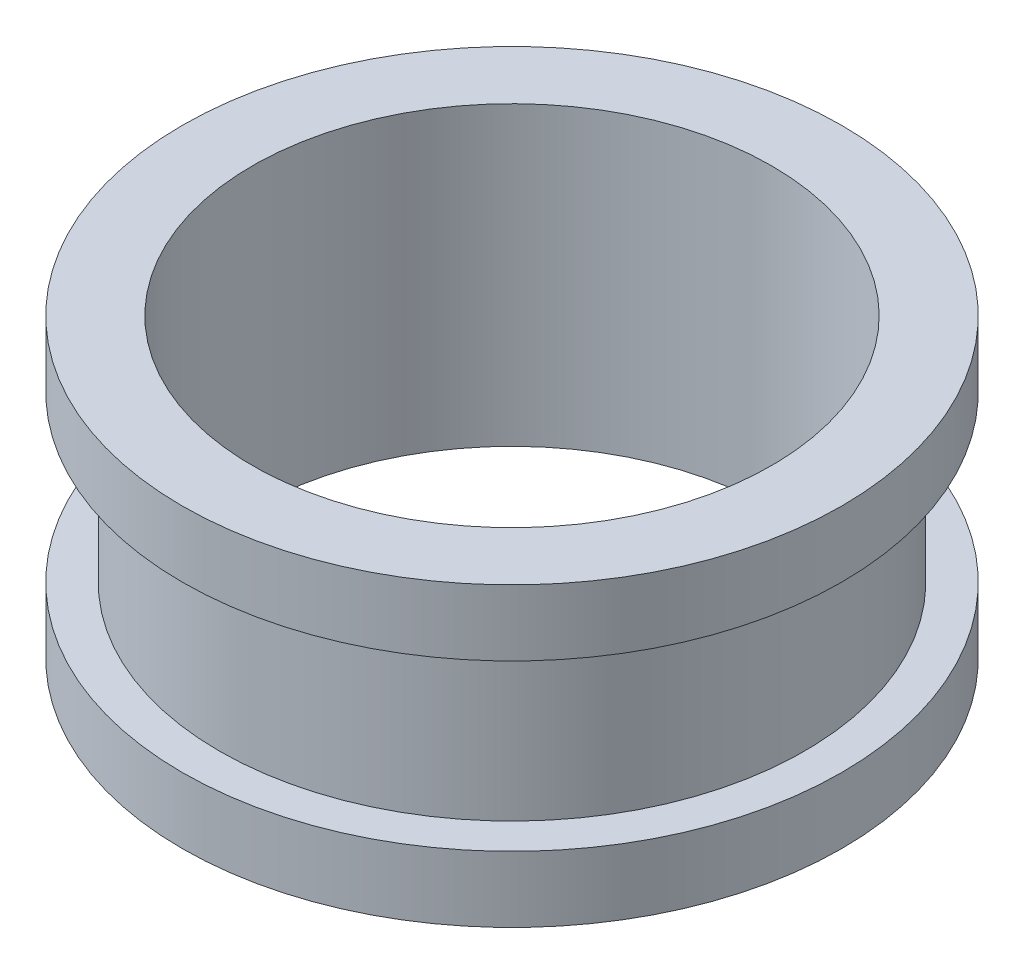
ISO-10303-21;
HEADER;
FILE_DESCRIPTION(('STEP AP214'),'2;1');
FILE_NAME('part.step','',(''),(''),'','','');
FILE_SCHEMA(('AUTOMOTIVE_DESIGN { 1 0 10303 214 1 1 1 1 }'));
ENDSEC;
DATA;
#1=APPLICATION_CONTEXT('core data for automotive mechanical design processes');
#2=APPLICATION_PROTOCOL_DEFINITION('international standard','automotive_design',2000,#1);
#3=PRODUCT_CONTEXT('',#1,'mechanical');
#4=PRODUCT('Part','Part','',(#3));
#5=PRODUCT_RELATED_PRODUCT_CATEGORY('part','',(#4));
#6=PRODUCT_DEFINITION_FORMATION('','',#4);
#7=PRODUCT_DEFINITION_CONTEXT('part definition',#1,'design');
#8=PRODUCT_DEFINITION('design','',#6,#7);
#9=PRODUCT_DEFINITION_SHAPE('','',#8);
#10=(LENGTH_UNIT() NAMED_UNIT(*) SI_UNIT(.MILLI.,.METRE.));
#11=(NAMED_UNIT(*) PLANE_ANGLE_UNIT() SI_UNIT($,.RADIAN.));
#12=(NAMED_UNIT(*) SI_UNIT($,.STERADIAN.) SOLID_ANGLE_UNIT());
#13=UNCERTAINTY_MEASURE_WITH_UNIT(LENGTH_MEASURE(1.E-05),#10,'distance_accuracy_value','');
#14=(GEOMETRIC_REPRESENTATION_CONTEXT(3) GLOBAL_UNCERTAINTY_ASSIGNED_CONTEXT((#13)) GLOBAL_UNIT_ASSIGNED_CONTEXT((#10,
#11,#12)) REPRESENTATION_CONTEXT('',''));
#15=CARTESIAN_POINT('',(0.,0.,0.));
#16=DIRECTION('',(0.,0.,1.));
#17=DIRECTION('',(1.,0.,0.));
#18=AXIS2_PLACEMENT_3D('',#15,#16,#17);
#19=CARTESIAN_POINT('',(4.,-0.8,0.));
#20=DIRECTION('',(0.,-1.,0.));
#21=DIRECTION('',(0.,0.,-1.));
#22=AXIS2_PLACEMENT_3D('',#19,#20,#21);
#23=PLANE('',#22);
#24=CARTESIAN_POINT('',(0.,-0.799999999999995,0.));
#25=DIRECTION('',(0.,-1.,0.));
#26=DIRECTION('',(0.,0.,-1.));
#27=AXIS2_PLACEMENT_3D('',#24,#25,#26);
#28=CIRCLE('',#27,4.);
#29=CARTESIAN_POINT('',(0.,-0.799999999999995,-4.));
#30=VERTEX_POINT('',#29);
#31=EDGE_CURVE('E63',#30,#30,#28,.T.);
#32=ORIENTED_EDGE('',*,*,#31,.T.);
#33=EDGE_LOOP('',(#32));
#34=FACE_BOUND('',#33,.T.);
#35=CARTESIAN_POINT('',(0.,-0.799999999999995,0.));
#36=DIRECTION('',(0.,-1.,0.));
#37=DIRECTION('',(0.,0.,-1.));
#38=AXIS2_PLACEMENT_3D('',#35,#36,#37);
#39=CIRCLE('',#38,3.15);
#40=CARTESIAN_POINT('',(0.,-0.799999999999995,-3.15));
#41=VERTEX_POINT('',#40);
#42=EDGE_CURVE('E10',#41,#41,#39,.T.);
#43=ORIENTED_EDGE('',*,*,#42,.F.);
#44=EDGE_LOOP('',(#43));
#45=FACE_BOUND('',#44,.T.);
#46=ADVANCED_FACE('F35',(#34,#45),#23,.T.);
#47=CARTESIAN_POINT('',(0.,-200.,0.));
#48=DIRECTION('',(0.,-1.,0.));
#49=DIRECTION('',(0.,0.,-1.));
#50=AXIS2_PLACEMENT_3D('',#47,#48,#49);
#51=CYLINDRICAL_SURFACE('',#50,3.15);
#52=ORIENTED_EDGE('',*,*,#42,.T.);
#53=EDGE_LOOP('',(#52));
#54=FACE_BOUND('',#53,.T.);
#55=CARTESIAN_POINT('',(0.,2.8,0.));
#56=DIRECTION('',(0.,-1.,0.));
#57=DIRECTION('',(0.,0.,-1.));
#58=AXIS2_PLACEMENT_3D('',#55,#56,#57);
#59=CIRCLE('',#58,3.15);
#60=CARTESIAN_POINT('',(0.,2.8,-3.15));
#61=VERTEX_POINT('',#60);
#62=EDGE_CURVE('E41',#61,#61,#59,.T.);
#63=ORIENTED_EDGE('',*,*,#62,.F.);
#64=EDGE_LOOP('',(#63));
#65=FACE_BOUND('',#64,.T.);
#66=ADVANCED_FACE('F81',(#54,#65),#51,.F.);
#67=CARTESIAN_POINT('',(3.15,2.8,0.));
#68=DIRECTION('',(0.,1.,0.));
#69=DIRECTION('',(0.,0.,1.));
#70=AXIS2_PLACEMENT_3D('',#67,#68,#69);
#71=PLANE('',#70);
#72=ORIENTED_EDGE('',*,*,#62,.T.);
#73=EDGE_LOOP('',(#72));
#74=FACE_BOUND('',#73,.T.);
#75=CARTESIAN_POINT('',(0.,2.8,0.));
#76=DIRECTION('',(0.,-1.,0.));
#77=DIRECTION('',(0.,0.,-1.));
#78=AXIS2_PLACEMENT_3D('',#75,#76,#77);
#79=CIRCLE('',#78,4.);
#80=CARTESIAN_POINT('',(0.,2.8,-4.));
#81=VERTEX_POINT('',#80);
#82=EDGE_CURVE('E45',#81,#81,#79,.T.);
#83=ORIENTED_EDGE('',*,*,#82,.F.);
#84=EDGE_LOOP('',(#83));
#85=FACE_BOUND('',#84,.T.);
#86=ADVANCED_FACE('F85',(#74,#85),#71,.T.);
#87=CARTESIAN_POINT('',(0.,-200.,0.));
#88=DIRECTION('',(0.,-1.,0.));
#89=DIRECTION('',(0.,0.,-1.));
#90=AXIS2_PLACEMENT_3D('',#87,#88,#89);
#91=CYLINDRICAL_SURFACE('',#90,4.);
#92=ORIENTED_EDGE('',*,*,#82,.T.);
#93=EDGE_LOOP('',(#92));
#94=FACE_BOUND('',#93,.T.);
#95=CARTESIAN_POINT('',(0.,2.,0.));
#96=DIRECTION('',(0.,-1.,0.));
#97=DIRECTION('',(0.,0.,-1.));
#98=AXIS2_PLACEMENT_3D('',#95,#96,#97);
#99=CIRCLE('',#98,4.);
#100=CARTESIAN_POINT('',(0.,2.,-4.));
#101=VERTEX_POINT('',#100);
#102=EDGE_CURVE('E49',#101,#101,#99,.T.);
#103=ORIENTED_EDGE('',*,*,#102,.F.);
#104=EDGE_LOOP('',(#103));
#105=FACE_BOUND('',#104,.T.);
#106=ADVANCED_FACE('F89',(#94,#105),#91,.T.);
#107=CARTESIAN_POINT('',(4.,2.,0.));
#108=DIRECTION('',(0.,-1.,0.));
#109=DIRECTION('',(0.,0.,-1.));
#110=AXIS2_PLACEMENT_3D('',#107,#108,#109);
#111=PLANE('',#110);
#112=ORIENTED_EDGE('',*,*,#102,.T.);
#113=EDGE_LOOP('',(#112));
#114=FACE_BOUND('',#113,.T.);
#115=CARTESIAN_POINT('',(0.,2.,0.));
#116=DIRECTION('',(0.,-1.,0.));
#117=DIRECTION('',(0.,0.,-1.));
#118=AXIS2_PLACEMENT_3D('',#115,#116,#117);
#119=CIRCLE('',#118,3.55);
#120=CARTESIAN_POINT('',(0.,2.,-3.55));
#121=VERTEX_POINT('',#120);
#122=EDGE_CURVE('E54',#121,#121,#119,.T.);
#123=ORIENTED_EDGE('',*,*,#122,.F.);
#124=EDGE_LOOP('',(#123));
#125=FACE_BOUND('',#124,.T.);
#126=ADVANCED_FACE('F95',(#114,#125),#111,.T.);
#127=CARTESIAN_POINT('',(0.,-200.,0.));
#128=DIRECTION('',(0.,-1.,0.));
#129=DIRECTION('',(0.,0.,-1.));
#130=AXIS2_PLACEMENT_3D('',#127,#128,#129);
#131=CYLINDRICAL_SURFACE('',#130,3.55);
#132=ORIENTED_EDGE('',*,*,#122,.T.);
#133=EDGE_LOOP('',(#132));
#134=FACE_BOUND('',#133,.T.);
#135=CARTESIAN_POINT('',(0.,0.,0.));
#136=DIRECTION('',(0.,-1.,0.));
#137=DIRECTION('',(0.,0.,-1.));
#138=AXIS2_PLACEMENT_3D('',#135,#136,#137);
#139=CIRCLE('',#138,3.55);
#140=CARTESIAN_POINT('',(0.,0.,-3.55));
#141=VERTEX_POINT('',#140);
#142=EDGE_CURVE('E57',#141,#141,#139,.T.);
#143=ORIENTED_EDGE('',*,*,#142,.F.);
#144=EDGE_LOOP('',(#143));
#145=FACE_BOUND('',#144,.T.);
#146=ADVANCED_FACE('F77',(#134,#145),#131,.T.);
#147=CARTESIAN_POINT('',(3.55,0.,0.));
#148=DIRECTION('',(0.,1.,0.));
#149=DIRECTION('',(0.,0.,1.));
#150=AXIS2_PLACEMENT_3D('',#147,#148,#149);
#151=PLANE('',#150);
#152=ORIENTED_EDGE('',*,*,#142,.T.);
#153=EDGE_LOOP('',(#152));
#154=FACE_BOUND('',#153,.T.);
#155=CARTESIAN_POINT('',(0.,0.,0.));
#156=DIRECTION('',(0.,-1.,0.));
#157=DIRECTION('',(0.,0.,-1.));
#158=AXIS2_PLACEMENT_3D('',#155,#156,#157);
#159=CIRCLE('',#158,4.);
#160=CARTESIAN_POINT('',(0.,0.,-4.));
#161=VERTEX_POINT('',#160);
#162=EDGE_CURVE('E60',#161,#161,#159,.T.);
#163=ORIENTED_EDGE('',*,*,#162,.F.);
#164=EDGE_LOOP('',(#163));
#165=FACE_BOUND('',#164,.T.);
#166=ADVANCED_FACE('F71',(#154,#165),#151,.T.);
#167=CARTESIAN_POINT('',(0.,-200.,0.));
#168=DIRECTION('',(0.,-1.,0.));
#169=DIRECTION('',(0.,0.,-1.));
#170=AXIS2_PLACEMENT_3D('',#167,#168,#169);
#171=CYLINDRICAL_SURFACE('',#170,4.);
#172=ORIENTED_EDGE('',*,*,#162,.T.);
#173=EDGE_LOOP('',(#172));
#174=FACE_BOUND('',#173,.T.);
#175=ORIENTED_EDGE('',*,*,#31,.F.);
#176=EDGE_LOOP('',(#175));
#177=FACE_BOUND('',#176,.T.);
#178=ADVANCED_FACE('F69',(#174,#177),#171,.T.);
#179=CLOSED_SHELL('',(#46,#66,#86,#106,#126,#146,#166,#178));
#180=MANIFOLD_SOLID_BREP('B2',#179);
#181=ADVANCED_BREP_SHAPE_REPRESENTATION('',(#18,#180),#14);
#182=SHAPE_DEFINITION_REPRESENTATION(#9,#181);
ENDSEC;
END-ISO-10303-21;
